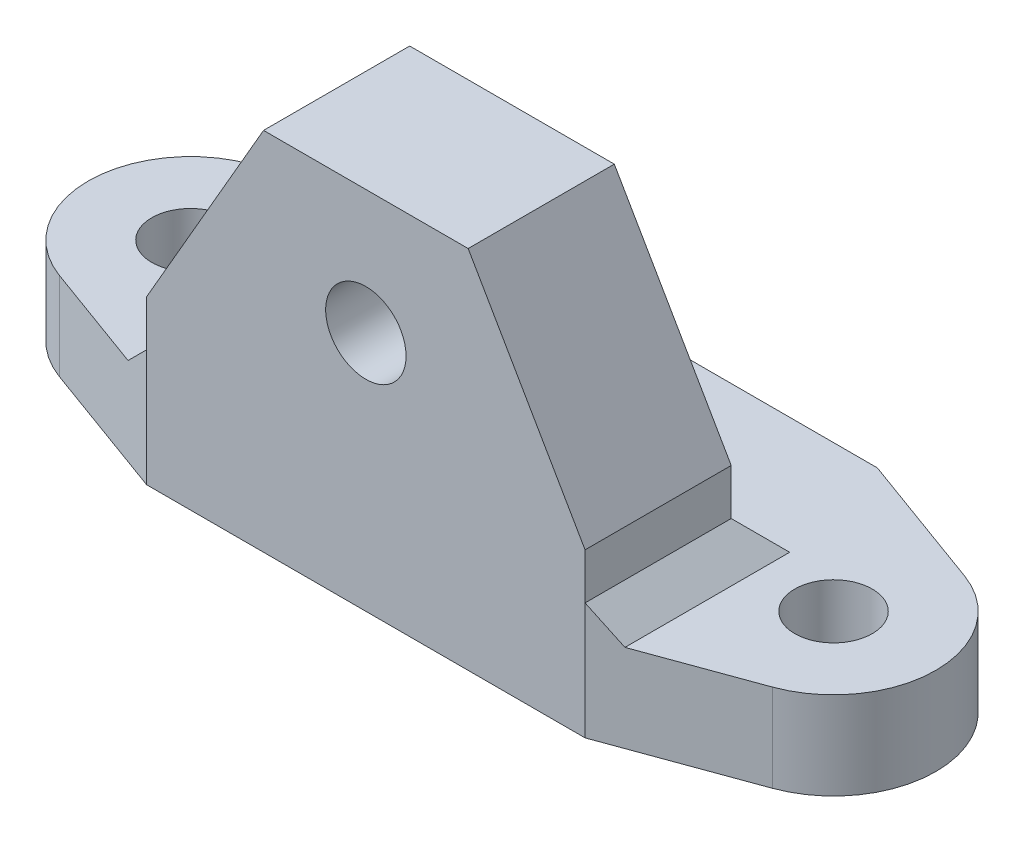
ISO-10303-21;
HEADER;
FILE_DESCRIPTION(('STEP AP214'),'2;1');
FILE_NAME('part.step','',(''),(''),'','','');
FILE_SCHEMA(('AUTOMOTIVE_DESIGN { 1 0 10303 214 1 1 1 1 }'));
ENDSEC;
DATA;
#1=APPLICATION_CONTEXT('core data for automotive mechanical design processes');
#2=APPLICATION_PROTOCOL_DEFINITION('international standard','automotive_design',2000,#1);
#3=PRODUCT_CONTEXT('',#1,'mechanical');
#4=PRODUCT('Part','Part','',(#3));
#5=PRODUCT_RELATED_PRODUCT_CATEGORY('part','',(#4));
#6=PRODUCT_DEFINITION_FORMATION('','',#4);
#7=PRODUCT_DEFINITION_CONTEXT('part definition',#1,'design');
#8=PRODUCT_DEFINITION('design','',#6,#7);
#9=PRODUCT_DEFINITION_SHAPE('','',#8);
#10=(LENGTH_UNIT() NAMED_UNIT(*) SI_UNIT(.MILLI.,.METRE.));
#11=(NAMED_UNIT(*) PLANE_ANGLE_UNIT() SI_UNIT($,.RADIAN.));
#12=(NAMED_UNIT(*) SI_UNIT($,.STERADIAN.) SOLID_ANGLE_UNIT());
#13=UNCERTAINTY_MEASURE_WITH_UNIT(LENGTH_MEASURE(1.E-05),#10,'distance_accuracy_value','');
#14=(GEOMETRIC_REPRESENTATION_CONTEXT(3) GLOBAL_UNCERTAINTY_ASSIGNED_CONTEXT((#13)) GLOBAL_UNIT_ASSIGNED_CONTEXT((#10,
#11,#12)) REPRESENTATION_CONTEXT('',''));
#15=CARTESIAN_POINT('',(0.,0.,0.));
#16=DIRECTION('',(0.,0.,1.));
#17=DIRECTION('',(1.,0.,0.));
#18=AXIS2_PLACEMENT_3D('',#15,#16,#17);
#19=CARTESIAN_POINT('',(15.,12.5,20.));
#20=DIRECTION('',(-1.,0.,0.));
#21=DIRECTION('',(0.,-1.,0.));
#22=AXIS2_PLACEMENT_3D('',#19,#20,#21);
#23=PLANE('',#22);
#24=DIRECTION('',(0.,1.,0.));
#25=VECTOR('',#24,1.);
#26=CARTESIAN_POINT('',(15.,12.5,20.));
#27=LINE('',#26,#25);
#28=CARTESIAN_POINT('',(15.,-4.49999999999998,20.));
#29=VERTEX_POINT('',#28);
#30=CARTESIAN_POINT('',(15.,-1.356406460551,20.));
#31=VERTEX_POINT('',#30);
#32=EDGE_CURVE('E123',#29,#31,#27,.T.);
#33=ORIENTED_EDGE('',*,*,#32,.F.);
#34=DIRECTION('',(0.,0.,-1.));
#35=VECTOR('',#34,1.);
#36=CARTESIAN_POINT('',(15.,-4.49999999999998,10.));
#37=LINE('',#36,#35);
#38=CARTESIAN_POINT('',(15.,-4.49999999999998,10.));
#39=VERTEX_POINT('',#38);
#40=EDGE_CURVE('E58',#29,#39,#37,.T.);
#41=ORIENTED_EDGE('',*,*,#40,.T.);
#42=DIRECTION('',(0.,1.,0.));
#43=VECTOR('',#42,1.);
#44=CARTESIAN_POINT('',(15.,12.5,10.));
#45=LINE('',#44,#43);
#46=CARTESIAN_POINT('',(15.,-1.356406460551,10.));
#47=VERTEX_POINT('',#46);
#48=EDGE_CURVE('E229',#39,#47,#45,.T.);
#49=ORIENTED_EDGE('',*,*,#48,.T.);
#50=DIRECTION('',(0.,0.,1.));
#51=VECTOR('',#50,1.);
#52=CARTESIAN_POINT('',(15.,-1.356406460551,20.));
#53=LINE('',#52,#51);
#54=EDGE_CURVE('E160',#47,#31,#53,.T.);
#55=ORIENTED_EDGE('',*,*,#54,.T.);
#56=EDGE_LOOP('',(#33,#41,#49,#55));
#57=FACE_BOUND('',#56,.T.);
#58=ADVANCED_FACE('F33',(#57),#23,.F.);
#59=CARTESIAN_POINT('',(-15.,12.5,20.));
#60=DIRECTION('',(0.,-1.,0.));
#61=DIRECTION('',(0.,0.,-1.));
#62=AXIS2_PLACEMENT_3D('',#59,#60,#61);
#63=PLANE('',#62);
#64=DIRECTION('',(0.,0.,-1.));
#65=VECTOR('',#64,1.);
#66=CARTESIAN_POINT('',(6.99999999999998,12.5,20.));
#67=LINE('',#66,#65);
#68=CARTESIAN_POINT('',(6.99999999999998,12.5,20.));
#69=VERTEX_POINT('',#68);
#70=CARTESIAN_POINT('',(6.99999999999998,12.5,10.));
#71=VERTEX_POINT('',#70);
#72=EDGE_CURVE('E156',#69,#71,#67,.T.);
#73=ORIENTED_EDGE('',*,*,#72,.T.);
#74=DIRECTION('',(1.,0.,0.));
#75=VECTOR('',#74,1.);
#76=CARTESIAN_POINT('',(-20.,12.5,10.));
#77=LINE('',#76,#75);
#78=CARTESIAN_POINT('',(-6.99999999999999,12.5,10.));
#79=VERTEX_POINT('',#78);
#80=EDGE_CURVE('E116',#79,#71,#77,.T.);
#81=ORIENTED_EDGE('',*,*,#80,.F.);
#82=DIRECTION('',(0.,0.,1.));
#83=VECTOR('',#82,1.);
#84=CARTESIAN_POINT('',(-6.99999999999999,12.5,20.));
#85=LINE('',#84,#83);
#86=CARTESIAN_POINT('',(-6.99999999999999,12.5,20.));
#87=VERTEX_POINT('',#86);
#88=EDGE_CURVE('E153',#79,#87,#85,.T.);
#89=ORIENTED_EDGE('',*,*,#88,.T.);
#90=DIRECTION('',(-1.,0.,0.));
#91=VECTOR('',#90,1.);
#92=CARTESIAN_POINT('',(-15.,12.5,20.));
#93=LINE('',#92,#91);
#94=EDGE_CURVE('E133',#69,#87,#93,.T.);
#95=ORIENTED_EDGE('',*,*,#94,.F.);
#96=EDGE_LOOP('',(#73,#81,#89,#95));
#97=FACE_BOUND('',#96,.T.);
#98=ADVANCED_FACE('F220',(#97),#63,.F.);
#99=CARTESIAN_POINT('',(-15.,12.5,20.));
#100=DIRECTION('',(1.,0.,0.));
#101=DIRECTION('',(0.,1.,0.));
#102=AXIS2_PLACEMENT_3D('',#99,#100,#101);
#103=PLANE('',#102);
#104=DIRECTION('',(0.,-1.,0.));
#105=VECTOR('',#104,1.);
#106=CARTESIAN_POINT('',(-15.,12.5,10.));
#107=LINE('',#106,#105);
#108=CARTESIAN_POINT('',(-15.,-1.356406460551,10.));
#109=VERTEX_POINT('',#108);
#110=CARTESIAN_POINT('',(-15.,-4.49999999999998,10.));
#111=VERTEX_POINT('',#110);
#112=EDGE_CURVE('E216',#109,#111,#107,.T.);
#113=ORIENTED_EDGE('',*,*,#112,.T.);
#114=DIRECTION('',(0.,0.,1.));
#115=VECTOR('',#114,1.);
#116=CARTESIAN_POINT('',(-15.,-4.49999999999998,20.));
#117=LINE('',#116,#115);
#118=CARTESIAN_POINT('',(-15.,-4.49999999999998,20.));
#119=VERTEX_POINT('',#118);
#120=EDGE_CURVE('E110',#111,#119,#117,.T.);
#121=ORIENTED_EDGE('',*,*,#120,.T.);
#122=DIRECTION('',(0.,-1.,0.));
#123=VECTOR('',#122,1.);
#124=CARTESIAN_POINT('',(-15.,12.5,20.));
#125=LINE('',#124,#123);
#126=CARTESIAN_POINT('',(-15.,-1.356406460551,20.));
#127=VERTEX_POINT('',#126);
#128=EDGE_CURVE('E164',#127,#119,#125,.T.);
#129=ORIENTED_EDGE('',*,*,#128,.F.);
#130=DIRECTION('',(0.,0.,-1.));
#131=VECTOR('',#130,1.);
#132=CARTESIAN_POINT('',(-15.,-1.356406460551,20.));
#133=LINE('',#132,#131);
#134=EDGE_CURVE('E188',#127,#109,#133,.T.);
#135=ORIENTED_EDGE('',*,*,#134,.T.);
#136=EDGE_LOOP('',(#113,#121,#129,#135));
#137=FACE_BOUND('',#136,.T.);
#138=ADVANCED_FACE('F206',(#137),#103,.F.);
#139=CARTESIAN_POINT('',(-15.,-12.5,20.));
#140=DIRECTION('',(0.,1.,0.));
#141=DIRECTION('',(0.,0.,1.));
#142=AXIS2_PLACEMENT_3D('',#139,#140,#141);
#143=PLANE('',#142);
#144=DIRECTION('',(1.,0.,0.));
#145=VECTOR('',#144,1.);
#146=CARTESIAN_POINT('',(-15.,-12.5,0.));
#147=LINE('',#146,#145);
#148=CARTESIAN_POINT('',(-15.,-12.5,0.));
#149=VERTEX_POINT('',#148);
#150=CARTESIAN_POINT('',(15.,-12.5,0.));
#151=VERTEX_POINT('',#150);
#152=EDGE_CURVE('E126',#149,#151,#147,.T.);
#153=ORIENTED_EDGE('',*,*,#152,.T.);
#154=DIRECTION('',(0.939597315436242,0.,0.342281879194631));
#155=VECTOR('',#154,1.);
#156=CARTESIAN_POINT('',(15.,-12.5,0.));
#157=LINE('',#156,#155);
#158=CARTESIAN_POINT('',(24.3959731543624,-12.5,3.42281879194631));
#159=VERTEX_POINT('',#158);
#160=EDGE_CURVE('E243',#151,#159,#157,.T.);
#161=ORIENTED_EDGE('',*,*,#160,.T.);
#162=CARTESIAN_POINT('',(22.,-12.5,10.));
#163=DIRECTION('',(0.,-1.,0.));
#164=DIRECTION('',(0.,0.,1.));
#165=AXIS2_PLACEMENT_3D('',#162,#163,#164);
#166=CIRCLE('',#165,7.);
#167=CARTESIAN_POINT('',(24.3959731543624,-12.5,16.5771812080537));
#168=VERTEX_POINT('',#167);
#169=EDGE_CURVE('E238',#159,#168,#166,.T.);
#170=ORIENTED_EDGE('',*,*,#169,.T.);
#171=DIRECTION('',(-0.939597315436242,0.,0.342281879194631));
#172=VECTOR('',#171,1.);
#173=CARTESIAN_POINT('',(15.,-12.5,20.));
#174=LINE('',#173,#172);
#175=CARTESIAN_POINT('',(15.,-12.5,20.));
#176=VERTEX_POINT('',#175);
#177=EDGE_CURVE('E246',#168,#176,#174,.T.);
#178=ORIENTED_EDGE('',*,*,#177,.T.);
#179=DIRECTION('',(1.,0.,0.));
#180=VECTOR('',#179,1.);
#181=CARTESIAN_POINT('',(-15.,-12.5,20.));
#182=LINE('',#181,#180);
#183=CARTESIAN_POINT('',(-15.,-12.5,20.));
#184=VERTEX_POINT('',#183);
#185=EDGE_CURVE('E157',#184,#176,#182,.T.);
#186=ORIENTED_EDGE('',*,*,#185,.F.);
#187=DIRECTION('',(-0.939597315436242,0.,-0.342281879194631));
#188=VECTOR('',#187,1.);
#189=CARTESIAN_POINT('',(-15.,-12.5,20.));
#190=LINE('',#189,#188);
#191=CARTESIAN_POINT('',(-24.3959731543624,-12.5,16.5771812080537));
#192=VERTEX_POINT('',#191);
#193=EDGE_CURVE('E260',#184,#192,#190,.T.);
#194=ORIENTED_EDGE('',*,*,#193,.T.);
#195=CARTESIAN_POINT('',(-22.,-12.5,10.));
#196=DIRECTION('',(0.,-1.,0.));
#197=DIRECTION('',(0.,0.,-1.));
#198=AXIS2_PLACEMENT_3D('',#195,#196,#197);
#199=CIRCLE('',#198,7.);
#200=CARTESIAN_POINT('',(-24.3959731543624,-12.5,3.42281879194631));
#201=VERTEX_POINT('',#200);
#202=EDGE_CURVE('E268',#192,#201,#199,.T.);
#203=ORIENTED_EDGE('',*,*,#202,.T.);
#204=DIRECTION('',(0.939597315436242,0.,-0.34228187919463));
#205=VECTOR('',#204,1.);
#206=CARTESIAN_POINT('',(-15.,-12.5,0.));
#207=LINE('',#206,#205);
#208=EDGE_CURVE('E182',#201,#149,#207,.T.);
#209=ORIENTED_EDGE('',*,*,#208,.T.);
#210=EDGE_LOOP('',(#153,#161,#170,#178,#186,#194,#203,#209));
#211=FACE_BOUND('',#210,.T.);
#212=CARTESIAN_POINT('',(-22.,-12.5,10.));
#213=DIRECTION('',(0.,-1.,0.));
#214=DIRECTION('',(0.,0.,-1.));
#215=AXIS2_PLACEMENT_3D('',#212,#213,#214);
#216=CIRCLE('',#215,2.65);
#217=CARTESIAN_POINT('',(-22.,-12.5,7.35));
#218=VERTEX_POINT('',#217);
#219=EDGE_CURVE('E254',#218,#218,#216,.T.);
#220=ORIENTED_EDGE('',*,*,#219,.F.);
#221=EDGE_LOOP('',(#220));
#222=FACE_BOUND('',#221,.T.);
#223=CARTESIAN_POINT('',(22.,-12.5,10.));
#224=DIRECTION('',(0.,-1.,0.));
#225=DIRECTION('',(0.,0.,1.));
#226=AXIS2_PLACEMENT_3D('',#223,#224,#225);
#227=CIRCLE('',#226,2.65);
#228=CARTESIAN_POINT('',(22.,-12.5,12.65));
#229=VERTEX_POINT('',#228);
#230=EDGE_CURVE('E234',#229,#229,#227,.T.);
#231=ORIENTED_EDGE('',*,*,#230,.F.);
#232=EDGE_LOOP('',(#231));
#233=FACE_BOUND('',#232,.T.);
#234=ADVANCED_FACE('F347',(#211,#222,#233),#143,.F.);
#235=CARTESIAN_POINT('',(0.,0.,20.));
#236=DIRECTION('',(0.,0.,1.));
#237=DIRECTION('',(1.,0.,0.));
#238=AXIS2_PLACEMENT_3D('',#235,#236,#237);
#239=PLANE('',#238);
#240=CARTESIAN_POINT('',(0.,4.,20.));
#241=DIRECTION('',(0.,0.,1.));
#242=DIRECTION('',(1.,0.,0.));
#243=AXIS2_PLACEMENT_3D('',#240,#241,#242);
#244=CIRCLE('',#243,2.75);
#245=CARTESIAN_POINT('',(2.75,4.,20.));
#246=VERTEX_POINT('',#245);
#247=EDGE_CURVE('E282',#246,#246,#244,.T.);
#248=ORIENTED_EDGE('',*,*,#247,.F.);
#249=EDGE_LOOP('',(#248));
#250=FACE_BOUND('',#249,.T.);
#251=EDGE_CURVE('E50',#176,#29,#27,.T.);
#252=ORIENTED_EDGE('',*,*,#251,.T.);
#253=ORIENTED_EDGE('',*,*,#32,.T.);
#254=DIRECTION('',(0.500000000000001,-0.866025403784438,0.));
#255=VECTOR('',#254,1.);
#256=CARTESIAN_POINT('',(10.6626587736527,6.15608891324555,20.));
#257=LINE('',#256,#255);
#258=EDGE_CURVE('E190',#31,#69,#257,.F.);
#259=ORIENTED_EDGE('',*,*,#258,.T.);
#260=ORIENTED_EDGE('',*,*,#94,.T.);
#261=DIRECTION('',(0.500000000000001,0.866025403784438,0.));
#262=VECTOR('',#261,1.);
#263=CARTESIAN_POINT('',(-10.6626587736527,6.15608891324555,20.));
#264=LINE('',#263,#262);
#265=EDGE_CURVE('E163',#87,#127,#264,.F.);
#266=ORIENTED_EDGE('',*,*,#265,.T.);
#267=ORIENTED_EDGE('',*,*,#128,.T.);
#268=DIRECTION('',(0.,-1.,0.));
#269=VECTOR('',#268,1.);
#270=CARTESIAN_POINT('',(-15.,-6.5,20.));
#271=LINE('',#270,#269);
#272=EDGE_CURVE('E72',#119,#184,#271,.T.);
#273=ORIENTED_EDGE('',*,*,#272,.T.);
#274=ORIENTED_EDGE('',*,*,#185,.T.);
#275=EDGE_LOOP('',(#252,#253,#259,#260,#266,#267,#273,#274));
#276=FACE_BOUND('',#275,.T.);
#277=ADVANCED_FACE('F199',(#250,#276),#239,.T.);
#278=CARTESIAN_POINT('',(0.,0.,0.));
#279=DIRECTION('',(0.,0.,1.));
#280=DIRECTION('',(1.,0.,0.));
#281=AXIS2_PLACEMENT_3D('',#278,#279,#280);
#282=PLANE('',#281);
#283=DIRECTION('',(0.,-1.,0.));
#284=VECTOR('',#283,1.);
#285=CARTESIAN_POINT('',(-15.,-6.5,0.));
#286=LINE('',#285,#284);
#287=CARTESIAN_POINT('',(-15.,-6.5,0.));
#288=VERTEX_POINT('',#287);
#289=EDGE_CURVE('E276',#288,#149,#286,.T.);
#290=ORIENTED_EDGE('',*,*,#289,.F.);
#291=DIRECTION('',(1.,0.,0.));
#292=VECTOR('',#291,1.);
#293=CARTESIAN_POINT('',(-20.,-6.5,0.));
#294=LINE('',#293,#292);
#295=CARTESIAN_POINT('',(15.,-6.5,0.));
#296=VERTEX_POINT('',#295);
#297=EDGE_CURVE('E113',#288,#296,#294,.T.);
#298=ORIENTED_EDGE('',*,*,#297,.T.);
#299=DIRECTION('',(0.,1.,0.));
#300=VECTOR('',#299,1.);
#301=CARTESIAN_POINT('',(15.,12.5,0.));
#302=LINE('',#301,#300);
#303=EDGE_CURVE('E139',#151,#296,#302,.T.);
#304=ORIENTED_EDGE('',*,*,#303,.F.);
#305=ORIENTED_EDGE('',*,*,#152,.F.);
#306=EDGE_LOOP('',(#290,#298,#304,#305));
#307=FACE_BOUND('',#306,.T.);
#308=ADVANCED_FACE('F303',(#307),#282,.F.);
#309=CARTESIAN_POINT('',(0.,4.,15.));
#310=DIRECTION('',(0.,0.,-1.));
#311=DIRECTION('',(-1.,0.,0.));
#312=AXIS2_PLACEMENT_3D('',#309,#310,#311);
#313=CYLINDRICAL_SURFACE('',#312,5.25);
#314=CARTESIAN_POINT('',(0.,4.,10.));
#315=DIRECTION('',(0.,0.,1.));
#316=DIRECTION('',(0.,-1.,0.));
#317=AXIS2_PLACEMENT_3D('',#314,#315,#316);
#318=CIRCLE('',#317,5.25);
#319=CARTESIAN_POINT('',(0.,-1.25,10.));
#320=VERTEX_POINT('',#319);
#321=EDGE_CURVE('E231',#320,#320,#318,.T.);
#322=ORIENTED_EDGE('',*,*,#321,.F.);
#323=EDGE_LOOP('',(#322));
#324=FACE_BOUND('',#323,.T.);
#325=CARTESIAN_POINT('',(0.,4.,15.));
#326=DIRECTION('',(0.,0.,1.));
#327=DIRECTION('',(1.,0.,0.));
#328=AXIS2_PLACEMENT_3D('',#325,#326,#327);
#329=CIRCLE('',#328,5.25);
#330=CARTESIAN_POINT('',(5.25,4.,15.));
#331=VERTEX_POINT('',#330);
#332=EDGE_CURVE('E131',#331,#331,#329,.T.);
#333=ORIENTED_EDGE('',*,*,#332,.T.);
#334=EDGE_LOOP('',(#333));
#335=FACE_BOUND('',#334,.T.);
#336=ADVANCED_FACE('F423',(#324,#335),#313,.F.);
#337=CARTESIAN_POINT('',(0.,4.,15.));
#338=DIRECTION('',(0.,0.,1.));
#339=DIRECTION('',(1.,0.,0.));
#340=AXIS2_PLACEMENT_3D('',#337,#338,#339);
#341=PLANE('',#340);
#342=CARTESIAN_POINT('',(0.,4.,15.));
#343=DIRECTION('',(0.,0.,1.));
#344=DIRECTION('',(1.,0.,0.));
#345=AXIS2_PLACEMENT_3D('',#342,#343,#344);
#346=CIRCLE('',#345,2.75);
#347=CARTESIAN_POINT('',(2.75,4.,15.));
#348=VERTEX_POINT('',#347);
#349=EDGE_CURVE('E280',#348,#348,#346,.T.);
#350=ORIENTED_EDGE('',*,*,#349,.T.);
#351=EDGE_LOOP('',(#350));
#352=FACE_BOUND('',#351,.T.);
#353=ORIENTED_EDGE('',*,*,#332,.F.);
#354=EDGE_LOOP('',(#353));
#355=FACE_BOUND('',#354,.T.);
#356=ADVANCED_FACE('F420',(#352,#355),#341,.F.);
#357=CARTESIAN_POINT('',(0.,4.,20.001));
#358=DIRECTION('',(0.,0.,-1.));
#359=DIRECTION('',(-1.,0.,0.));
#360=AXIS2_PLACEMENT_3D('',#357,#358,#359);
#361=CYLINDRICAL_SURFACE('',#360,2.75);
#362=ORIENTED_EDGE('',*,*,#247,.T.);
#363=EDGE_LOOP('',(#362));
#364=FACE_BOUND('',#363,.T.);
#365=ORIENTED_EDGE('',*,*,#349,.F.);
#366=EDGE_LOOP('',(#365));
#367=FACE_BOUND('',#366,.T.);
#368=ADVANCED_FACE('F413',(#364,#367),#361,.F.);
#369=CARTESIAN_POINT('',(-15.,-6.5,0.));
#370=DIRECTION('',(-0.34228187919463,0.,-0.939597315436242));
#371=DIRECTION('',(-0.939597315436242,0.,0.342281879194631));
#372=AXIS2_PLACEMENT_3D('',#369,#370,#371);
#373=PLANE('',#372);
#374=ORIENTED_EDGE('',*,*,#208,.F.);
#375=DIRECTION('',(0.,-1.,0.));
#376=VECTOR('',#375,1.);
#377=CARTESIAN_POINT('',(-24.3959731543624,-6.5,3.42281879194631));
#378=LINE('',#377,#376);
#379=CARTESIAN_POINT('',(-24.3959731543624,-6.5,3.42281879194631));
#380=VERTEX_POINT('',#379);
#381=EDGE_CURVE('E273',#380,#201,#378,.T.);
#382=ORIENTED_EDGE('',*,*,#381,.F.);
#383=DIRECTION('',(0.939597315436242,0.,-0.34228187919463));
#384=VECTOR('',#383,1.);
#385=CARTESIAN_POINT('',(-15.,-6.5,0.));
#386=LINE('',#385,#384);
#387=EDGE_CURVE('E265',#380,#288,#386,.T.);
#388=ORIENTED_EDGE('',*,*,#387,.T.);
#389=ORIENTED_EDGE('',*,*,#289,.T.);
#390=EDGE_LOOP('',(#374,#382,#388,#389));
#391=FACE_BOUND('',#390,.T.);
#392=ADVANCED_FACE('F352',(#391),#373,.T.);
#393=CARTESIAN_POINT('',(-22.,-6.5,10.));
#394=DIRECTION('',(0.,-1.,0.));
#395=DIRECTION('',(0.,0.,-1.));
#396=AXIS2_PLACEMENT_3D('',#393,#394,#395);
#397=CYLINDRICAL_SURFACE('',#396,7.);
#398=ORIENTED_EDGE('',*,*,#202,.F.);
#399=DIRECTION('',(0.,-1.,0.));
#400=VECTOR('',#399,1.);
#401=CARTESIAN_POINT('',(-24.3959731543624,-6.5,16.5771812080537));
#402=LINE('',#401,#400);
#403=CARTESIAN_POINT('',(-24.3959731543624,-6.5,16.5771812080537));
#404=VERTEX_POINT('',#403);
#405=EDGE_CURVE('E277',#404,#192,#402,.T.);
#406=ORIENTED_EDGE('',*,*,#405,.F.);
#407=CARTESIAN_POINT('',(-22.,-6.5,10.));
#408=DIRECTION('',(0.,-1.,0.));
#409=DIRECTION('',(0.,0.,-1.));
#410=AXIS2_PLACEMENT_3D('',#407,#408,#409);
#411=CIRCLE('',#410,7.);
#412=EDGE_CURVE('E181',#404,#380,#411,.T.);
#413=ORIENTED_EDGE('',*,*,#412,.T.);
#414=ORIENTED_EDGE('',*,*,#381,.T.);
#415=EDGE_LOOP('',(#398,#406,#413,#414));
#416=FACE_BOUND('',#415,.T.);
#417=ADVANCED_FACE('F366',(#416),#397,.T.);
#418=CARTESIAN_POINT('',(-15.,-6.5,20.));
#419=DIRECTION('',(-0.342281879194631,0.,0.939597315436241));
#420=DIRECTION('',(0.939597315436242,0.,0.342281879194631));
#421=AXIS2_PLACEMENT_3D('',#418,#419,#420);
#422=PLANE('',#421);
#423=ORIENTED_EDGE('',*,*,#193,.F.);
#424=ORIENTED_EDGE('',*,*,#272,.F.);
#425=DIRECTION('',(0.684754192471687,0.684754192471695,0.249446170114686));
#426=VECTOR('',#425,1.);
#427=CARTESIAN_POINT('',(-15.,-4.49999999999998,20.));
#428=LINE('',#427,#426);
#429=CARTESIAN_POINT('',(-17.,-6.5,19.2714285714286));
#430=VERTEX_POINT('',#429);
#431=EDGE_CURVE('E42',#119,#430,#428,.F.);
#432=ORIENTED_EDGE('',*,*,#431,.T.);
#433=DIRECTION('',(-0.939597315436242,0.,-0.342281879194631));
#434=VECTOR('',#433,1.);
#435=CARTESIAN_POINT('',(-15.,-6.5,20.));
#436=LINE('',#435,#434);
#437=EDGE_CURVE('E178',#430,#404,#436,.T.);
#438=ORIENTED_EDGE('',*,*,#437,.T.);
#439=ORIENTED_EDGE('',*,*,#405,.T.);
#440=EDGE_LOOP('',(#423,#424,#432,#438,#439));
#441=FACE_BOUND('',#440,.T.);
#442=ADVANCED_FACE('F362',(#441),#422,.T.);
#443=CARTESIAN_POINT('',(-22.,-6.5,10.));
#444=DIRECTION('',(0.,-1.,0.));
#445=DIRECTION('',(0.,0.,-1.));
#446=AXIS2_PLACEMENT_3D('',#443,#444,#445);
#447=PLANE('',#446);
#448=CARTESIAN_POINT('',(-22.,-6.5,10.));
#449=DIRECTION('',(0.,-1.,0.));
#450=DIRECTION('',(0.,0.,-1.));
#451=AXIS2_PLACEMENT_3D('',#448,#449,#450);
#452=CIRCLE('',#451,2.65);
#453=CARTESIAN_POINT('',(-22.,-6.5,7.35));
#454=VERTEX_POINT('',#453);
#455=EDGE_CURVE('E257',#454,#454,#452,.T.);
#456=ORIENTED_EDGE('',*,*,#455,.T.);
#457=EDGE_LOOP('',(#456));
#458=FACE_BOUND('',#457,.T.);
#459=ORIENTED_EDGE('',*,*,#437,.F.);
#460=DIRECTION('',(0.,0.,-1.));
#461=VECTOR('',#460,1.);
#462=CARTESIAN_POINT('',(-17.,-6.5,10.));
#463=LINE('',#462,#461);
#464=CARTESIAN_POINT('',(-17.,-6.5,8.));
#465=VERTEX_POINT('',#464);
#466=EDGE_CURVE('E101',#430,#465,#463,.T.);
#467=ORIENTED_EDGE('',*,*,#466,.T.);
#468=DIRECTION('',(1.,0.,0.));
#469=VECTOR('',#468,1.);
#470=CARTESIAN_POINT('',(15.,-6.5,8.));
#471=LINE('',#470,#469);
#472=CARTESIAN_POINT('',(17.,-6.5,8.));
#473=VERTEX_POINT('',#472);
#474=EDGE_CURVE('E92',#465,#473,#471,.T.);
#475=ORIENTED_EDGE('',*,*,#474,.T.);
#476=DIRECTION('',(0.,0.,1.));
#477=VECTOR('',#476,1.);
#478=CARTESIAN_POINT('',(17.,-6.5,20.));
#479=LINE('',#478,#477);
#480=CARTESIAN_POINT('',(17.,-6.5,19.2714285714286));
#481=VERTEX_POINT('',#480);
#482=EDGE_CURVE('E98',#473,#481,#479,.T.);
#483=ORIENTED_EDGE('',*,*,#482,.T.);
#484=DIRECTION('',(-0.939597315436242,0.,0.342281879194631));
#485=VECTOR('',#484,1.);
#486=CARTESIAN_POINT('',(15.,-6.5,20.));
#487=LINE('',#486,#485);
#488=CARTESIAN_POINT('',(24.3959731543624,-6.5,16.5771812080537));
#489=VERTEX_POINT('',#488);
#490=EDGE_CURVE('E146',#489,#481,#487,.T.);
#491=ORIENTED_EDGE('',*,*,#490,.F.);
#492=CARTESIAN_POINT('',(22.,-6.5,10.));
#493=DIRECTION('',(0.,-1.,0.));
#494=DIRECTION('',(0.,0.,1.));
#495=AXIS2_PLACEMENT_3D('',#492,#493,#494);
#496=CIRCLE('',#495,7.);
#497=CARTESIAN_POINT('',(24.3959731543624,-6.5,3.42281879194631));
#498=VERTEX_POINT('',#497);
#499=EDGE_CURVE('E150',#498,#489,#496,.T.);
#500=ORIENTED_EDGE('',*,*,#499,.F.);
#501=DIRECTION('',(0.939597315436242,0.,0.342281879194631));
#502=VECTOR('',#501,1.);
#503=CARTESIAN_POINT('',(15.,-6.5,0.));
#504=LINE('',#503,#502);
#505=EDGE_CURVE('E142',#296,#498,#504,.T.);
#506=ORIENTED_EDGE('',*,*,#505,.F.);
#507=ORIENTED_EDGE('',*,*,#297,.F.);
#508=ORIENTED_EDGE('',*,*,#387,.F.);
#509=ORIENTED_EDGE('',*,*,#412,.F.);
#510=EDGE_LOOP('',(#459,#467,#475,#483,#491,#500,#506,#507,#508,#509));
#511=FACE_BOUND('',#510,.T.);
#512=CARTESIAN_POINT('',(22.,-6.5,10.));
#513=DIRECTION('',(0.,-1.,0.));
#514=DIRECTION('',(0.,0.,1.));
#515=AXIS2_PLACEMENT_3D('',#512,#513,#514);
#516=CIRCLE('',#515,2.65);
#517=CARTESIAN_POINT('',(22.,-6.5,12.65));
#518=VERTEX_POINT('',#517);
#519=EDGE_CURVE('E235',#518,#518,#516,.T.);
#520=ORIENTED_EDGE('',*,*,#519,.T.);
#521=EDGE_LOOP('',(#520));
#522=FACE_BOUND('',#521,.T.);
#523=ADVANCED_FACE('F95',(#458,#511,#522),#447,.F.);
#524=CARTESIAN_POINT('',(-22.,-6.5,10.));
#525=DIRECTION('',(0.,-1.,0.));
#526=DIRECTION('',(0.,0.,-1.));
#527=AXIS2_PLACEMENT_3D('',#524,#525,#526);
#528=CYLINDRICAL_SURFACE('',#527,2.65);
#529=ORIENTED_EDGE('',*,*,#455,.F.);
#530=EDGE_LOOP('',(#529));
#531=FACE_BOUND('',#530,.T.);
#532=ORIENTED_EDGE('',*,*,#219,.T.);
#533=EDGE_LOOP('',(#532));
#534=FACE_BOUND('',#533,.T.);
#535=ADVANCED_FACE('F404',(#531,#534),#528,.F.);
#536=CARTESIAN_POINT('',(22.,-6.5,10.));
#537=DIRECTION('',(0.,-1.,0.));
#538=DIRECTION('',(0.,0.,-1.));
#539=AXIS2_PLACEMENT_3D('',#536,#537,#538);
#540=CYLINDRICAL_SURFACE('',#539,7.);
#541=ORIENTED_EDGE('',*,*,#169,.F.);
#542=DIRECTION('',(0.,-1.,0.));
#543=VECTOR('',#542,1.);
#544=CARTESIAN_POINT('',(24.3959731543624,-6.5,3.42281879194631));
#545=LINE('',#544,#543);
#546=EDGE_CURVE('E251',#498,#159,#545,.T.);
#547=ORIENTED_EDGE('',*,*,#546,.F.);
#548=ORIENTED_EDGE('',*,*,#499,.T.);
#549=DIRECTION('',(0.,-1.,0.));
#550=VECTOR('',#549,1.);
#551=CARTESIAN_POINT('',(24.3959731543624,-6.5,16.5771812080537));
#552=LINE('',#551,#550);
#553=EDGE_CURVE('E145',#489,#168,#552,.T.);
#554=ORIENTED_EDGE('',*,*,#553,.T.);
#555=EDGE_LOOP('',(#541,#547,#548,#554));
#556=FACE_BOUND('',#555,.T.);
#557=ADVANCED_FACE('F345',(#556),#540,.T.);
#558=CARTESIAN_POINT('',(15.,-6.5,0.));
#559=DIRECTION('',(0.342281879194631,0.,-0.939597315436242));
#560=DIRECTION('',(-0.939597315436242,0.,-0.342281879194631));
#561=AXIS2_PLACEMENT_3D('',#558,#559,#560);
#562=PLANE('',#561);
#563=ORIENTED_EDGE('',*,*,#160,.F.);
#564=ORIENTED_EDGE('',*,*,#303,.T.);
#565=ORIENTED_EDGE('',*,*,#505,.T.);
#566=ORIENTED_EDGE('',*,*,#546,.T.);
#567=EDGE_LOOP('',(#563,#564,#565,#566));
#568=FACE_BOUND('',#567,.T.);
#569=ADVANCED_FACE('F293',(#568),#562,.T.);
#570=CARTESIAN_POINT('',(15.,-6.5,20.));
#571=DIRECTION('',(0.342281879194631,0.,0.939597315436241));
#572=DIRECTION('',(0.939597315436242,0.,-0.342281879194631));
#573=AXIS2_PLACEMENT_3D('',#570,#571,#572);
#574=PLANE('',#573);
#575=ORIENTED_EDGE('',*,*,#177,.F.);
#576=ORIENTED_EDGE('',*,*,#553,.F.);
#577=ORIENTED_EDGE('',*,*,#490,.T.);
#578=DIRECTION('',(0.684754192471688,-0.684754192471694,-0.249446170114686));
#579=VECTOR('',#578,1.);
#580=CARTESIAN_POINT('',(15.,-4.49999999999998,20.));
#581=LINE('',#580,#579);
#582=EDGE_CURVE('E11',#481,#29,#581,.F.);
#583=ORIENTED_EDGE('',*,*,#582,.T.);
#584=ORIENTED_EDGE('',*,*,#251,.F.);
#585=EDGE_LOOP('',(#575,#576,#577,#583,#584));
#586=FACE_BOUND('',#585,.T.);
#587=ADVANCED_FACE('F341',(#586),#574,.T.);
#588=CARTESIAN_POINT('',(22.,-6.5,10.));
#589=DIRECTION('',(0.,-1.,0.));
#590=DIRECTION('',(0.,0.,-1.));
#591=AXIS2_PLACEMENT_3D('',#588,#589,#590);
#592=CYLINDRICAL_SURFACE('',#591,2.65);
#593=ORIENTED_EDGE('',*,*,#519,.F.);
#594=EDGE_LOOP('',(#593));
#595=FACE_BOUND('',#594,.T.);
#596=ORIENTED_EDGE('',*,*,#230,.T.);
#597=EDGE_LOOP('',(#596));
#598=FACE_BOUND('',#597,.T.);
#599=ADVANCED_FACE('F384',(#595,#598),#592,.F.);
#600=CARTESIAN_POINT('',(6.99999999999998,12.5,20.));
#601=DIRECTION('',(-0.866025403784438,-0.500000000000001,0.));
#602=DIRECTION('',(0.,0.,-1.));
#603=AXIS2_PLACEMENT_3D('',#600,#601,#602);
#604=PLANE('',#603);
#605=DIRECTION('',(-0.500000000000001,0.866025403784438,0.));
#606=VECTOR('',#605,1.);
#607=CARTESIAN_POINT('',(6.99999999999998,12.5,10.));
#608=LINE('',#607,#606);
#609=EDGE_CURVE('E223',#71,#47,#608,.F.);
#610=ORIENTED_EDGE('',*,*,#609,.F.);
#611=ORIENTED_EDGE('',*,*,#72,.F.);
#612=ORIENTED_EDGE('',*,*,#258,.F.);
#613=ORIENTED_EDGE('',*,*,#54,.F.);
#614=EDGE_LOOP('',(#610,#611,#612,#613));
#615=FACE_BOUND('',#614,.T.);
#616=ADVANCED_FACE('F333',(#615),#604,.F.);
#617=CARTESIAN_POINT('',(-15.,-1.356406460551,20.));
#618=DIRECTION('',(0.866025403784438,-0.500000000000001,0.));
#619=DIRECTION('',(0.,0.,-1.));
#620=AXIS2_PLACEMENT_3D('',#617,#618,#619);
#621=PLANE('',#620);
#622=DIRECTION('',(-0.500000000000001,-0.866025403784438,0.));
#623=VECTOR('',#622,1.);
#624=CARTESIAN_POINT('',(-15.,-1.356406460551,10.));
#625=LINE('',#624,#623);
#626=EDGE_CURVE('E185',#109,#79,#625,.F.);
#627=ORIENTED_EDGE('',*,*,#626,.F.);
#628=ORIENTED_EDGE('',*,*,#134,.F.);
#629=ORIENTED_EDGE('',*,*,#265,.F.);
#630=ORIENTED_EDGE('',*,*,#88,.F.);
#631=EDGE_LOOP('',(#627,#628,#629,#630));
#632=FACE_BOUND('',#631,.T.);
#633=ADVANCED_FACE('F208',(#632),#621,.F.);
#634=CARTESIAN_POINT('',(-20.,12.5,10.));
#635=DIRECTION('',(0.,0.,1.));
#636=DIRECTION('',(0.,-1.,0.));
#637=AXIS2_PLACEMENT_3D('',#634,#635,#636);
#638=PLANE('',#637);
#639=ORIENTED_EDGE('',*,*,#321,.T.);
#640=EDGE_LOOP('',(#639));
#641=FACE_BOUND('',#640,.T.);
#642=ORIENTED_EDGE('',*,*,#48,.F.);
#643=DIRECTION('',(-1.,0.,0.));
#644=VECTOR('',#643,1.);
#645=CARTESIAN_POINT('',(-15.,-4.49999999999998,10.));
#646=LINE('',#645,#644);
#647=EDGE_CURVE('E83',#39,#111,#646,.T.);
#648=ORIENTED_EDGE('',*,*,#647,.T.);
#649=ORIENTED_EDGE('',*,*,#112,.F.);
#650=ORIENTED_EDGE('',*,*,#626,.T.);
#651=ORIENTED_EDGE('',*,*,#80,.T.);
#652=ORIENTED_EDGE('',*,*,#609,.T.);
#653=EDGE_LOOP('',(#642,#648,#649,#650,#651,#652));
#654=FACE_BOUND('',#653,.T.);
#655=ADVANCED_FACE('F212',(#641,#654),#638,.F.);
#656=CARTESIAN_POINT('',(15.,-4.49999999999998,20.));
#657=DIRECTION('',(0.707106781186551,0.707106781186544,0.));
#658=DIRECTION('',(0.,0.,1.));
#659=AXIS2_PLACEMENT_3D('',#656,#657,#658);
#660=PLANE('',#659);
#661=ORIENTED_EDGE('',*,*,#582,.F.);
#662=ORIENTED_EDGE('',*,*,#482,.F.);
#663=DIRECTION('',(-0.577350269189624,0.57735026918963,0.577350269189623));
#664=VECTOR('',#663,1.);
#665=CARTESIAN_POINT('',(11.6666666666667,-1.16666666666664,13.3333333333333));
#666=LINE('',#665,#664);
#667=EDGE_CURVE('E37',#39,#473,#666,.F.);
#668=ORIENTED_EDGE('',*,*,#667,.F.);
#669=ORIENTED_EDGE('',*,*,#40,.F.);
#670=EDGE_LOOP('',(#661,#662,#668,#669));
#671=FACE_BOUND('',#670,.T.);
#672=ADVANCED_FACE('F35',(#671),#660,.T.);
#673=CARTESIAN_POINT('',(-22.,-6.5,8.));
#674=DIRECTION('',(0.,0.707106781186544,-0.707106781186552));
#675=DIRECTION('',(-1.,0.,0.));
#676=AXIS2_PLACEMENT_3D('',#673,#674,#675);
#677=PLANE('',#676);
#678=ORIENTED_EDGE('',*,*,#667,.T.);
#679=ORIENTED_EDGE('',*,*,#474,.F.);
#680=DIRECTION('',(0.577350269189624,0.57735026918963,0.577350269189624));
#681=VECTOR('',#680,1.);
#682=CARTESIAN_POINT('',(-18.6666666666666,-8.16666666666667,6.33333333333335));
#683=LINE('',#682,#681);
#684=EDGE_CURVE('E114',#111,#465,#683,.F.);
#685=ORIENTED_EDGE('',*,*,#684,.F.);
#686=ORIENTED_EDGE('',*,*,#647,.F.);
#687=EDGE_LOOP('',(#678,#679,#685,#686));
#688=FACE_BOUND('',#687,.T.);
#689=ADVANCED_FACE('F112',(#688),#677,.T.);
#690=CARTESIAN_POINT('',(-15.,-4.49999999999998,20.));
#691=DIRECTION('',(-0.707106781186551,0.707106781186543,0.));
#692=DIRECTION('',(0.,0.,-1.));
#693=AXIS2_PLACEMENT_3D('',#690,#691,#692);
#694=PLANE('',#693);
#695=ORIENTED_EDGE('',*,*,#684,.T.);
#696=ORIENTED_EDGE('',*,*,#466,.F.);
#697=ORIENTED_EDGE('',*,*,#431,.F.);
#698=ORIENTED_EDGE('',*,*,#120,.F.);
#699=EDGE_LOOP('',(#695,#696,#697,#698));
#700=FACE_BOUND('',#699,.T.);
#701=ADVANCED_FACE('F368',(#700),#694,.T.);
#702=CLOSED_SHELL('',(#58,#98,#138,#234,#277,#308,#336,#356,#368,#392,#417,#442,#523,#535,#557,
#569,#587,#599,#616,#633,#655,#672,#689,#701));
#703=MANIFOLD_SOLID_BREP('B2',#702);
#704=ADVANCED_BREP_SHAPE_REPRESENTATION('',(#18,#703),#14);
#705=SHAPE_DEFINITION_REPRESENTATION(#9,#704);
ENDSEC;
END-ISO-10303-21;
